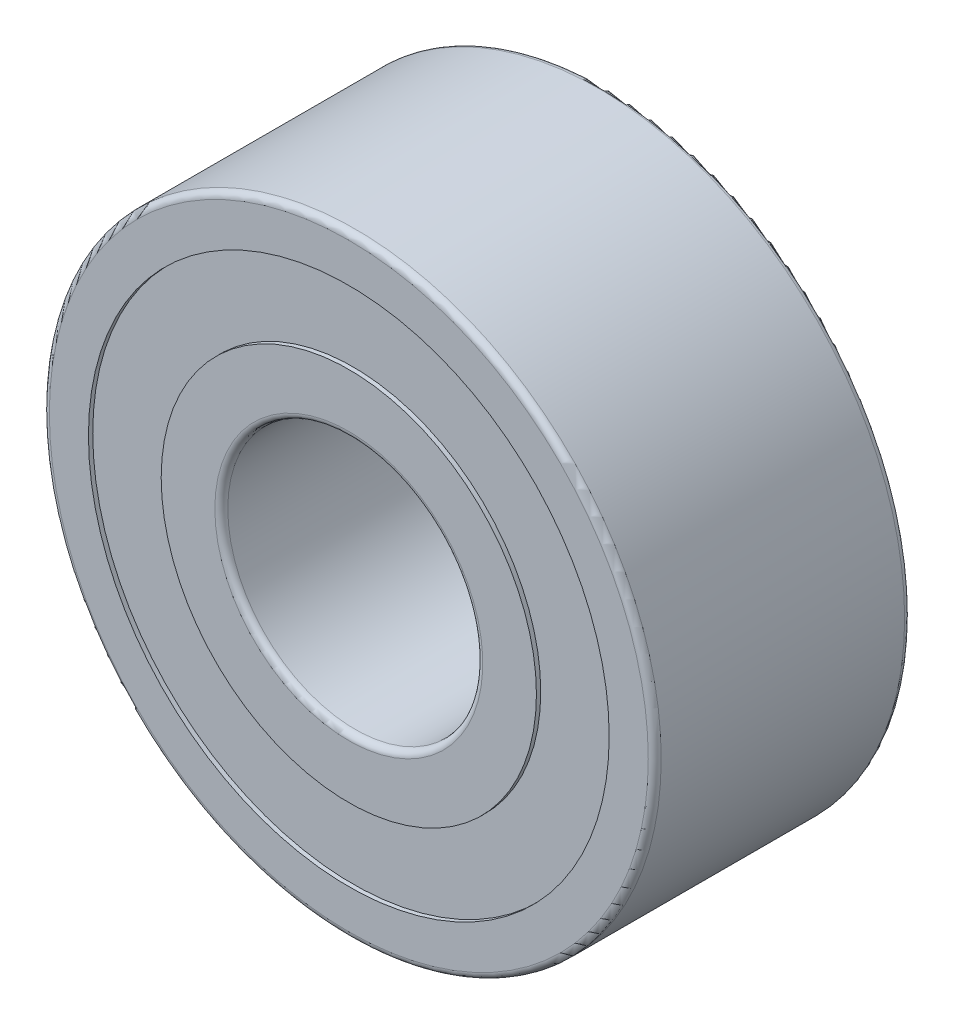
ISO-10303-21;
HEADER;
FILE_DESCRIPTION(('STEP AP214'),'2;1');
FILE_NAME('part.step','',(''),(''),'','','');
FILE_SCHEMA(('AUTOMOTIVE_DESIGN { 1 0 10303 214 1 1 1 1 }'));
ENDSEC;
DATA;
#1=APPLICATION_CONTEXT('core data for automotive mechanical design processes');
#2=APPLICATION_PROTOCOL_DEFINITION('international standard','automotive_design',2000,#1);
#3=PRODUCT_CONTEXT('',#1,'mechanical');
#4=PRODUCT('Part','Part','',(#3));
#5=PRODUCT_RELATED_PRODUCT_CATEGORY('part','',(#4));
#6=PRODUCT_DEFINITION_FORMATION('','',#4);
#7=PRODUCT_DEFINITION_CONTEXT('part definition',#1,'design');
#8=PRODUCT_DEFINITION('design','',#6,#7);
#9=PRODUCT_DEFINITION_SHAPE('','',#8);
#10=(LENGTH_UNIT() NAMED_UNIT(*) SI_UNIT(.MILLI.,.METRE.));
#11=(NAMED_UNIT(*) PLANE_ANGLE_UNIT() SI_UNIT($,.RADIAN.));
#12=(NAMED_UNIT(*) SI_UNIT($,.STERADIAN.) SOLID_ANGLE_UNIT());
#13=UNCERTAINTY_MEASURE_WITH_UNIT(LENGTH_MEASURE(1.E-05),#10,'distance_accuracy_value','');
#14=(GEOMETRIC_REPRESENTATION_CONTEXT(3) GLOBAL_UNCERTAINTY_ASSIGNED_CONTEXT((#13)) GLOBAL_UNIT_ASSIGNED_CONTEXT((#10,
#11,#12)) REPRESENTATION_CONTEXT('',''));
#15=CARTESIAN_POINT('',(0.,0.,0.));
#16=DIRECTION('',(0.,0.,1.));
#17=DIRECTION('',(1.,0.,0.));
#18=AXIS2_PLACEMENT_3D('',#15,#16,#17);
#19=CARTESIAN_POINT('',(0.,0.,0.));
#20=DIRECTION('',(0.,0.,-1.));
#21=DIRECTION('',(-1.00000000000001,0.,0.));
#22=AXIS2_PLACEMENT_3D('',#19,#20,#21);
#23=CYLINDRICAL_SURFACE('',#22,22.0726);
#24=CARTESIAN_POINT('',(0.,0.,13.81125));
#25=DIRECTION('',(0.,0.,-1.));
#26=DIRECTION('',(-1.00000000000001,0.,0.));
#27=AXIS2_PLACEMENT_3D('',#24,#25,#26);
#28=CIRCLE('',#27,22.0726);
#29=CARTESIAN_POINT('',(-22.0726000000001,0.,13.81125));
#30=VERTEX_POINT('',#29);
#31=EDGE_CURVE('E11',#30,#30,#28,.T.);
#32=ORIENTED_EDGE('',*,*,#31,.T.);
#33=EDGE_LOOP('',(#32));
#34=FACE_BOUND('',#33,.T.);
#35=CARTESIAN_POINT('',(0.,0.,14.57325));
#36=DIRECTION('',(0.,0.,-1.));
#37=DIRECTION('',(-1.00000000000001,0.,0.));
#38=AXIS2_PLACEMENT_3D('',#35,#36,#37);
#39=CIRCLE('',#38,22.0726);
#40=CARTESIAN_POINT('',(-22.0726000000001,0.,14.57325));
#41=VERTEX_POINT('',#40);
#42=EDGE_CURVE('E61',#41,#41,#39,.T.);
#43=ORIENTED_EDGE('',*,*,#42,.F.);
#44=EDGE_LOOP('',(#43));
#45=FACE_BOUND('',#44,.T.);
#46=ADVANCED_FACE('F47',(#34,#45),#23,.F.);
#47=CARTESIAN_POINT('',(0.,22.0726000000001,13.81125));
#48=DIRECTION('',(0.,0.,-1.));
#49=DIRECTION('',(-1.00000000000001,0.,0.));
#50=AXIS2_PLACEMENT_3D('',#47,#48,#49);
#51=PLANE('',#50);
#52=CARTESIAN_POINT('',(0.,0.,13.81125));
#53=DIRECTION('',(0.,0.,-1.));
#54=DIRECTION('',(-1.00000000000001,0.,0.));
#55=AXIS2_PLACEMENT_3D('',#52,#53,#54);
#56=CIRCLE('',#55,30.6324);
#57=CARTESIAN_POINT('',(-30.6324000000002,0.,13.81125));
#58=VERTEX_POINT('',#57);
#59=EDGE_CURVE('E53',#58,#58,#56,.T.);
#60=ORIENTED_EDGE('',*,*,#59,.T.);
#61=EDGE_LOOP('',(#60));
#62=FACE_BOUND('',#61,.T.);
#63=ORIENTED_EDGE('',*,*,#31,.F.);
#64=EDGE_LOOP('',(#63));
#65=FACE_BOUND('',#64,.T.);
#66=ADVANCED_FACE('F71',(#62,#65),#51,.T.);
#67=CARTESIAN_POINT('',(0.,0.,0.));
#68=DIRECTION('',(0.,0.,-1.));
#69=DIRECTION('',(-1.00000000000001,0.,0.));
#70=AXIS2_PLACEMENT_3D('',#67,#68,#69);
#71=CYLINDRICAL_SURFACE('',#70,30.6324);
#72=CARTESIAN_POINT('',(0.,0.,14.57325));
#73=DIRECTION('',(0.,0.,-1.));
#74=DIRECTION('',(-1.00000000000001,0.,0.));
#75=AXIS2_PLACEMENT_3D('',#72,#73,#74);
#76=CIRCLE('',#75,30.6324);
#77=CARTESIAN_POINT('',(-30.6324000000002,0.,14.57325));
#78=VERTEX_POINT('',#77);
#79=EDGE_CURVE('E57',#78,#78,#76,.T.);
#80=ORIENTED_EDGE('',*,*,#79,.T.);
#81=EDGE_LOOP('',(#80));
#82=FACE_BOUND('',#81,.T.);
#83=ORIENTED_EDGE('',*,*,#59,.F.);
#84=EDGE_LOOP('',(#83));
#85=FACE_BOUND('',#84,.T.);
#86=ADVANCED_FACE('F75',(#82,#85),#71,.T.);
#87=CARTESIAN_POINT('',(0.,22.0726000000001,14.57325));
#88=DIRECTION('',(0.,0.,1.));
#89=DIRECTION('',(1.00000000000001,0.,0.));
#90=AXIS2_PLACEMENT_3D('',#87,#88,#89);
#91=PLANE('',#90);
#92=ORIENTED_EDGE('',*,*,#42,.T.);
#93=EDGE_LOOP('',(#92));
#94=FACE_BOUND('',#93,.T.);
#95=ORIENTED_EDGE('',*,*,#79,.F.);
#96=EDGE_LOOP('',(#95));
#97=FACE_BOUND('',#96,.T.);
#98=ADVANCED_FACE('F67',(#94,#97),#91,.T.);
#99=CLOSED_SHELL('',(#46,#66,#86,#98));
#100=MANIFOLD_SOLID_BREP('B2',#99);
#101=CARTESIAN_POINT('',(0.,22.0726000000001,-13.81125));
#102=DIRECTION('',(0.,0.,1.));
#103=DIRECTION('',(1.00000000000001,0.,0.));
#104=AXIS2_PLACEMENT_3D('',#101,#102,#103);
#105=PLANE('',#104);
#106=CARTESIAN_POINT('',(0.,0.,-13.81125));
#107=DIRECTION('',(0.,0.,-1.));
#108=DIRECTION('',(-1.00000000000001,0.,0.));
#109=AXIS2_PLACEMENT_3D('',#106,#107,#108);
#110=CIRCLE('',#109,22.0726);
#111=CARTESIAN_POINT('',(-22.0726000000001,0.,-13.81125));
#112=VERTEX_POINT('',#111);
#113=EDGE_CURVE('E46',#112,#112,#110,.T.);
#114=ORIENTED_EDGE('',*,*,#113,.T.);
#115=EDGE_LOOP('',(#114));
#116=FACE_BOUND('',#115,.T.);
#117=CARTESIAN_POINT('',(0.,0.,-13.81125));
#118=DIRECTION('',(0.,0.,-1.));
#119=DIRECTION('',(-1.00000000000001,0.,0.));
#120=AXIS2_PLACEMENT_3D('',#117,#118,#119);
#121=CIRCLE('',#120,30.6324);
#122=CARTESIAN_POINT('',(-30.6324000000002,0.,-13.81125));
#123=VERTEX_POINT('',#122);
#124=EDGE_CURVE('E120',#123,#123,#121,.T.);
#125=ORIENTED_EDGE('',*,*,#124,.F.);
#126=EDGE_LOOP('',(#125));
#127=FACE_BOUND('',#126,.T.);
#128=ADVANCED_FACE('F106',(#116,#127),#105,.T.);
#129=CARTESIAN_POINT('',(0.,0.,0.));
#130=DIRECTION('',(0.,0.,-1.));
#131=DIRECTION('',(-1.00000000000001,0.,0.));
#132=AXIS2_PLACEMENT_3D('',#129,#130,#131);
#133=CYLINDRICAL_SURFACE('',#132,22.0726);
#134=CARTESIAN_POINT('',(0.,0.,-14.57325));
#135=DIRECTION('',(0.,0.,-1.));
#136=DIRECTION('',(-1.00000000000001,0.,0.));
#137=AXIS2_PLACEMENT_3D('',#134,#135,#136);
#138=CIRCLE('',#137,22.0726);
#139=CARTESIAN_POINT('',(-22.0726000000001,0.,-14.57325));
#140=VERTEX_POINT('',#139);
#141=EDGE_CURVE('E112',#140,#140,#138,.T.);
#142=ORIENTED_EDGE('',*,*,#141,.T.);
#143=EDGE_LOOP('',(#142));
#144=FACE_BOUND('',#143,.T.);
#145=ORIENTED_EDGE('',*,*,#113,.F.);
#146=EDGE_LOOP('',(#145));
#147=FACE_BOUND('',#146,.T.);
#148=ADVANCED_FACE('F130',(#144,#147),#133,.F.);
#149=CARTESIAN_POINT('',(0.,22.0726000000001,-14.57325));
#150=DIRECTION('',(0.,0.,-1.));
#151=DIRECTION('',(-1.00000000000001,0.,0.));
#152=AXIS2_PLACEMENT_3D('',#149,#150,#151);
#153=PLANE('',#152);
#154=CARTESIAN_POINT('',(0.,0.,-14.57325));
#155=DIRECTION('',(0.,0.,-1.));
#156=DIRECTION('',(-1.00000000000001,0.,0.));
#157=AXIS2_PLACEMENT_3D('',#154,#155,#156);
#158=CIRCLE('',#157,30.6324);
#159=CARTESIAN_POINT('',(-30.6324000000002,0.,-14.57325));
#160=VERTEX_POINT('',#159);
#161=EDGE_CURVE('E116',#160,#160,#158,.T.);
#162=ORIENTED_EDGE('',*,*,#161,.T.);
#163=EDGE_LOOP('',(#162));
#164=FACE_BOUND('',#163,.T.);
#165=ORIENTED_EDGE('',*,*,#141,.F.);
#166=EDGE_LOOP('',(#165));
#167=FACE_BOUND('',#166,.T.);
#168=ADVANCED_FACE('F134',(#164,#167),#153,.T.);
#169=CARTESIAN_POINT('',(0.,0.,0.));
#170=DIRECTION('',(0.,0.,-1.));
#171=DIRECTION('',(-1.00000000000001,0.,0.));
#172=AXIS2_PLACEMENT_3D('',#169,#170,#171);
#173=CYLINDRICAL_SURFACE('',#172,30.6324);
#174=ORIENTED_EDGE('',*,*,#124,.T.);
#175=EDGE_LOOP('',(#174));
#176=FACE_BOUND('',#175,.T.);
#177=ORIENTED_EDGE('',*,*,#161,.F.);
#178=EDGE_LOOP('',(#177));
#179=FACE_BOUND('',#178,.T.);
#180=ADVANCED_FACE('F126',(#176,#179),#173,.T.);
#181=CLOSED_SHELL('',(#128,#148,#168,#180));
#182=MANIFOLD_SOLID_BREP('B6',#181);
#183=CARTESIAN_POINT('',(18.6340314512184,18.6340314512188,-7.9375));
#184=DIRECTION('',(-0.707106781186543,-0.70710678118656,0.));
#185=DIRECTION('',(0.,0.,-1.));
#186=AXIS2_PLACEMENT_3D('',#183,#184,#185);
#187=SPHERICAL_SURFACE('',#186,5.55625);
#188=CARTESIAN_POINT('',(14.7051693982506,14.705169398251,-7.9375));
#189=VERTEX_POINT('',#188);
#190=VERTEX_LOOP('',#189);
#191=FACE_BOUND('',#190,.T.);
#192=ADVANCED_FACE('F165',(#191),#187,.T.);
#193=CLOSED_SHELL('',(#192));
#194=MANIFOLD_SOLID_BREP('B41',#193);
#195=CARTESIAN_POINT('',(26.3525000000001,2.75821032680312E-13,-7.9375));
#196=DIRECTION('',(-1.,0.,0.));
#197=DIRECTION('',(0.,0.,-1.));
#198=AXIS2_PLACEMENT_3D('',#195,#196,#197);
#199=SPHERICAL_SURFACE('',#198,5.55625);
#200=CARTESIAN_POINT('',(20.7962500000001,2.1814390571695E-13,-7.9375));
#201=VERTEX_POINT('',#200);
#202=VERTEX_LOOP('',#201);
#203=FACE_BOUND('',#202,.T.);
#204=ADVANCED_FACE('F181',(#203),#199,.T.);
#205=CLOSED_SHELL('',(#204));
#206=MANIFOLD_SOLID_BREP('B102',#205);
#207=CARTESIAN_POINT('',(18.6340314512188,-18.6340314512184,-7.9375));
#208=DIRECTION('',(-0.707106781186558,0.707106781186545,0.));
#209=DIRECTION('',(0.,0.,-1.));
#210=AXIS2_PLACEMENT_3D('',#207,#208,#209);
#211=SPHERICAL_SURFACE('',#210,5.55625);
#212=CARTESIAN_POINT('',(14.705169398251,-14.7051693982507,-7.9375));
#213=VERTEX_POINT('',#212);
#214=VERTEX_LOOP('',#213);
#215=FACE_BOUND('',#214,.T.);
#216=ADVANCED_FACE('F197',(#215),#211,.T.);
#217=CLOSED_SHELL('',(#216));
#218=MANIFOLD_SOLID_BREP('B161',#217);
#219=CARTESIAN_POINT('',(0.,-26.3525000000001,-7.9375));
#220=DIRECTION('',(0.,1.00000000000001,0.));
#221=DIRECTION('',(0.,0.,-1.));
#222=AXIS2_PLACEMENT_3D('',#219,#220,#221);
#223=SPHERICAL_SURFACE('',#222,5.55625);
#224=CARTESIAN_POINT('',(0.,-20.7962500000001,-7.9375));
#225=VERTEX_POINT('',#224);
#226=VERTEX_LOOP('',#225);
#227=FACE_BOUND('',#226,.T.);
#228=ADVANCED_FACE('F213',(#227),#223,.T.);
#229=CLOSED_SHELL('',(#228));
#230=MANIFOLD_SOLID_BREP('B177',#229);
#231=CARTESIAN_POINT('',(-18.6340314512185,-18.6340314512187,-7.9375));
#232=DIRECTION('',(0.707106781186547,0.707106781186555,0.));
#233=DIRECTION('',(0.,0.,-1.));
#234=AXIS2_PLACEMENT_3D('',#231,#232,#233);
#235=SPHERICAL_SURFACE('',#234,5.55625);
#236=CARTESIAN_POINT('',(-14.7051693982507,-14.7051693982509,-7.9375));
#237=VERTEX_POINT('',#236);
#238=VERTEX_LOOP('',#237);
#239=FACE_BOUND('',#238,.T.);
#240=ADVANCED_FACE('F229',(#239),#235,.T.);
#241=CLOSED_SHELL('',(#240));
#242=MANIFOLD_SOLID_BREP('B193',#241);
#243=CARTESIAN_POINT('',(-26.3525000000001,0.,-7.9375));
#244=DIRECTION('',(1.,0.,0.));
#245=DIRECTION('',(0.,0.,-1.));
#246=AXIS2_PLACEMENT_3D('',#243,#244,#245);
#247=SPHERICAL_SURFACE('',#246,5.55625);
#248=CARTESIAN_POINT('',(-20.7962500000001,0.,-7.9375));
#249=VERTEX_POINT('',#248);
#250=VERTEX_LOOP('',#249);
#251=FACE_BOUND('',#250,.T.);
#252=ADVANCED_FACE('F245',(#251),#247,.T.);
#253=CLOSED_SHELL('',(#252));
#254=MANIFOLD_SOLID_BREP('B209',#253);
#255=CARTESIAN_POINT('',(-18.6340314512186,18.6340314512185,-7.9375));
#256=DIRECTION('',(0.707106781186553,-0.70710678118655,0.));
#257=DIRECTION('',(0.,0.,-1.));
#258=AXIS2_PLACEMENT_3D('',#255,#256,#257);
#259=SPHERICAL_SURFACE('',#258,5.55625);
#260=CARTESIAN_POINT('',(-14.7051693982509,14.7051693982508,-7.9375));
#261=VERTEX_POINT('',#260);
#262=VERTEX_LOOP('',#261);
#263=FACE_BOUND('',#262,.T.);
#264=ADVANCED_FACE('F261',(#263),#259,.T.);
#265=CLOSED_SHELL('',(#264));
#266=MANIFOLD_SOLID_BREP('B225',#265);
#267=CARTESIAN_POINT('',(18.6340314512184,18.6340314512188,7.9375));
#268=DIRECTION('',(0.707106781186543,0.70710678118656,0.));
#269=DIRECTION('',(0.,0.,-1.));
#270=AXIS2_PLACEMENT_3D('',#267,#268,#269);
#271=SPHERICAL_SURFACE('',#270,5.55625);
#272=CARTESIAN_POINT('',(22.5628935041861,22.5628935041867,7.9375));
#273=VERTEX_POINT('',#272);
#274=VERTEX_LOOP('',#273);
#275=FACE_BOUND('',#274,.T.);
#276=ADVANCED_FACE('F277',(#275),#271,.T.);
#277=CLOSED_SHELL('',(#276));
#278=MANIFOLD_SOLID_BREP('B241',#277);
#279=CARTESIAN_POINT('',(26.3525000000001,2.75821032680312E-13,7.9375));
#280=DIRECTION('',(1.,0.,0.));
#281=DIRECTION('',(0.,0.,-1.));
#282=AXIS2_PLACEMENT_3D('',#279,#280,#281);
#283=SPHERICAL_SURFACE('',#282,5.55625);
#284=CARTESIAN_POINT('',(31.9087500000001,3.33498159643675E-13,7.9375));
#285=VERTEX_POINT('',#284);
#286=VERTEX_LOOP('',#285);
#287=FACE_BOUND('',#286,.T.);
#288=ADVANCED_FACE('F293',(#287),#283,.T.);
#289=CLOSED_SHELL('',(#288));
#290=MANIFOLD_SOLID_BREP('B257',#289);
#291=CARTESIAN_POINT('',(18.6340314512188,-18.6340314512184,7.9375));
#292=DIRECTION('',(0.707106781186558,-0.707106781186545,0.));
#293=DIRECTION('',(0.,0.,-1.));
#294=AXIS2_PLACEMENT_3D('',#291,#292,#293);
#295=SPHERICAL_SURFACE('',#294,5.55625);
#296=CARTESIAN_POINT('',(22.5628935041866,-22.5628935041862,7.9375));
#297=VERTEX_POINT('',#296);
#298=VERTEX_LOOP('',#297);
#299=FACE_BOUND('',#298,.T.);
#300=ADVANCED_FACE('F309',(#299),#295,.T.);
#301=CLOSED_SHELL('',(#300));
#302=MANIFOLD_SOLID_BREP('B273',#301);
#303=CARTESIAN_POINT('',(0.,-26.3525000000001,7.9375));
#304=DIRECTION('',(0.,-1.00000000000001,0.));
#305=DIRECTION('',(0.,0.,-1.));
#306=AXIS2_PLACEMENT_3D('',#303,#304,#305);
#307=SPHERICAL_SURFACE('',#306,5.55625);
#308=CARTESIAN_POINT('',(0.,-31.9087500000002,7.9375));
#309=VERTEX_POINT('',#308);
#310=VERTEX_LOOP('',#309);
#311=FACE_BOUND('',#310,.T.);
#312=ADVANCED_FACE('F325',(#311),#307,.T.);
#313=CLOSED_SHELL('',(#312));
#314=MANIFOLD_SOLID_BREP('B289',#313);
#315=CARTESIAN_POINT('',(-18.6340314512185,-18.6340314512187,7.9375));
#316=DIRECTION('',(-0.707106781186547,-0.707106781186555,0.));
#317=DIRECTION('',(0.,0.,-1.));
#318=AXIS2_PLACEMENT_3D('',#315,#316,#317);
#319=SPHERICAL_SURFACE('',#318,5.55625);
#320=CARTESIAN_POINT('',(-22.5628935041862,-22.5628935041865,7.9375));
#321=VERTEX_POINT('',#320);
#322=VERTEX_LOOP('',#321);
#323=FACE_BOUND('',#322,.T.);
#324=ADVANCED_FACE('F341',(#323),#319,.T.);
#325=CLOSED_SHELL('',(#324));
#326=MANIFOLD_SOLID_BREP('B305',#325);
#327=CARTESIAN_POINT('',(-26.3525000000001,0.,7.9375));
#328=DIRECTION('',(-1.,0.,0.));
#329=DIRECTION('',(0.,0.,-1.));
#330=AXIS2_PLACEMENT_3D('',#327,#328,#329);
#331=SPHERICAL_SURFACE('',#330,5.55625);
#332=CARTESIAN_POINT('',(-31.9087500000002,-1.14841122722531E-13,7.9375));
#333=VERTEX_POINT('',#332);
#334=VERTEX_LOOP('',#333);
#335=FACE_BOUND('',#334,.T.);
#336=ADVANCED_FACE('F357',(#335),#331,.T.);
#337=CLOSED_SHELL('',(#336));
#338=MANIFOLD_SOLID_BREP('B321',#337);
#339=CARTESIAN_POINT('',(-18.6340314512186,18.6340314512185,7.9375));
#340=DIRECTION('',(-0.707106781186553,0.70710678118655,0.));
#341=DIRECTION('',(0.,0.,-1.));
#342=AXIS2_PLACEMENT_3D('',#339,#340,#341);
#343=SPHERICAL_SURFACE('',#342,5.55625);
#344=CARTESIAN_POINT('',(-22.5628935041864,22.5628935041863,7.9375));
#345=VERTEX_POINT('',#344);
#346=VERTEX_LOOP('',#345);
#347=FACE_BOUND('',#346,.T.);
#348=ADVANCED_FACE('F373',(#347),#343,.T.);
#349=CLOSED_SHELL('',(#348));
#350=MANIFOLD_SOLID_BREP('B337',#349);
#351=CARTESIAN_POINT('',(0.,26.3525000000001,7.9375));
#352=DIRECTION('',(0.,1.00000000000001,0.));
#353=DIRECTION('',(0.,0.,-1.));
#354=AXIS2_PLACEMENT_3D('',#351,#352,#353);
#355=SPHERICAL_SURFACE('',#354,5.55625);
#356=CARTESIAN_POINT('',(0.,31.9087500000002,7.9375));
#357=VERTEX_POINT('',#356);
#358=VERTEX_LOOP('',#357);
#359=FACE_BOUND('',#358,.T.);
#360=ADVANCED_FACE('F389',(#359),#355,.T.);
#361=CLOSED_SHELL('',(#360));
#362=MANIFOLD_SOLID_BREP('B353',#361);
#363=CARTESIAN_POINT('',(0.,26.3525000000001,-7.9375));
#364=DIRECTION('',(0.,-1.00000000000001,0.));
#365=DIRECTION('',(0.,0.,-1.));
#366=AXIS2_PLACEMENT_3D('',#363,#364,#365);
#367=SPHERICAL_SURFACE('',#366,5.55625);
#368=CARTESIAN_POINT('',(0.,20.7962500000001,-7.9375));
#369=VERTEX_POINT('',#368);
#370=VERTEX_LOOP('',#369);
#371=FACE_BOUND('',#370,.T.);
#372=ADVANCED_FACE('F407',(#371),#367,.T.);
#373=CLOSED_SHELL('',(#372));
#374=MANIFOLD_SOLID_BREP('B369',#373);
#375=CARTESIAN_POINT('',(0.,0.,0.));
#376=DIRECTION('',(0.,0.,1.));
#377=DIRECTION('',(1.00000000000001,0.,0.));
#378=AXIS2_PLACEMENT_3D('',#375,#376,#377);
#379=CYLINDRICAL_SURFACE('',#378,30.6324);
#380=CARTESIAN_POINT('',(0.,0.,-15.08125));
#381=DIRECTION('',(0.,0.,1.));
#382=DIRECTION('',(1.00000000000001,0.,0.));
#383=AXIS2_PLACEMENT_3D('',#380,#381,#382);
#384=CIRCLE('',#383,30.6324);
#385=CARTESIAN_POINT('',(30.6324000000002,0.,-15.08125));
#386=VERTEX_POINT('',#385);
#387=EDGE_CURVE('E459',#386,#386,#384,.T.);
#388=ORIENTED_EDGE('',*,*,#387,.F.);
#389=EDGE_LOOP('',(#388));
#390=FACE_BOUND('',#389,.T.);
#391=CARTESIAN_POINT('',(0.,0.,-11.4807146495097));
#392=DIRECTION('',(0.,0.,1.));
#393=DIRECTION('',(1.00000000000001,0.,0.));
#394=AXIS2_PLACEMENT_3D('',#391,#392,#393);
#395=CIRCLE('',#394,30.6324);
#396=CARTESIAN_POINT('',(30.6324000000002,0.,-11.4807146495097));
#397=VERTEX_POINT('',#396);
#398=EDGE_CURVE('E444',#397,#397,#395,.T.);
#399=ORIENTED_EDGE('',*,*,#398,.T.);
#400=EDGE_LOOP('',(#399));
#401=FACE_BOUND('',#400,.T.);
#402=ADVANCED_FACE('F424',(#390,#401),#379,.F.);
#403=CARTESIAN_POINT('',(0.,0.,-7.9375));
#404=DIRECTION('',(0.,0.,1.));
#405=DIRECTION('',(1.00000000000001,0.,0.));
#406=AXIS2_PLACEMENT_3D('',#403,#404,#405);
#407=TOROIDAL_SURFACE('',#406,26.3525,5.55625);
#408=ORIENTED_EDGE('',*,*,#398,.F.);
#409=EDGE_LOOP('',(#408));
#410=FACE_BOUND('',#409,.T.);
#411=CARTESIAN_POINT('',(0.,0.,-4.39428535049031));
#412=DIRECTION('',(0.,0.,1.));
#413=DIRECTION('',(1.00000000000001,0.,0.));
#414=AXIS2_PLACEMENT_3D('',#411,#412,#413);
#415=CIRCLE('',#414,30.6324);
#416=CARTESIAN_POINT('',(30.6324000000002,0.,-4.39428535049031));
#417=VERTEX_POINT('',#416);
#418=EDGE_CURVE('E447',#417,#417,#415,.T.);
#419=ORIENTED_EDGE('',*,*,#418,.T.);
#420=EDGE_LOOP('',(#419));
#421=FACE_BOUND('',#420,.T.);
#422=ADVANCED_FACE('F467',(#410,#421),#407,.F.);
#423=CARTESIAN_POINT('',(0.,0.,0.));
#424=DIRECTION('',(0.,0.,1.));
#425=DIRECTION('',(1.00000000000001,0.,0.));
#426=AXIS2_PLACEMENT_3D('',#423,#424,#425);
#427=CYLINDRICAL_SURFACE('',#426,30.6324);
#428=ORIENTED_EDGE('',*,*,#418,.F.);
#429=EDGE_LOOP('',(#428));
#430=FACE_BOUND('',#429,.T.);
#431=CARTESIAN_POINT('',(0.,0.,4.39428535049031));
#432=DIRECTION('',(0.,0.,1.));
#433=DIRECTION('',(1.00000000000001,0.,0.));
#434=AXIS2_PLACEMENT_3D('',#431,#432,#433);
#435=CIRCLE('',#434,30.6324);
#436=CARTESIAN_POINT('',(30.6324000000002,0.,4.39428535049031));
#437=VERTEX_POINT('',#436);
#438=EDGE_CURVE('E450',#437,#437,#435,.T.);
#439=ORIENTED_EDGE('',*,*,#438,.T.);
#440=EDGE_LOOP('',(#439));
#441=FACE_BOUND('',#440,.T.);
#442=ADVANCED_FACE('F473',(#430,#441),#427,.F.);
#443=CARTESIAN_POINT('',(0.,0.,7.9375));
#444=DIRECTION('',(0.,0.,1.));
#445=DIRECTION('',(1.00000000000001,0.,0.));
#446=AXIS2_PLACEMENT_3D('',#443,#444,#445);
#447=TOROIDAL_SURFACE('',#446,26.3525,5.55625);
#448=ORIENTED_EDGE('',*,*,#438,.F.);
#449=EDGE_LOOP('',(#448));
#450=FACE_BOUND('',#449,.T.);
#451=CARTESIAN_POINT('',(0.,0.,11.4807146495097));
#452=DIRECTION('',(0.,0.,1.));
#453=DIRECTION('',(1.00000000000001,0.,0.));
#454=AXIS2_PLACEMENT_3D('',#451,#452,#453);
#455=CIRCLE('',#454,30.6324);
#456=CARTESIAN_POINT('',(30.6324000000002,0.,11.4807146495097));
#457=VERTEX_POINT('',#456);
#458=EDGE_CURVE('E453',#457,#457,#455,.T.);
#459=ORIENTED_EDGE('',*,*,#458,.T.);
#460=EDGE_LOOP('',(#459));
#461=FACE_BOUND('',#460,.T.);
#462=ADVANCED_FACE('F479',(#450,#461),#447,.F.);
#463=CARTESIAN_POINT('',(0.,0.,0.));
#464=DIRECTION('',(0.,0.,1.));
#465=DIRECTION('',(1.00000000000001,0.,0.));
#466=AXIS2_PLACEMENT_3D('',#463,#464,#465);
#467=CYLINDRICAL_SURFACE('',#466,30.6324);
#468=ORIENTED_EDGE('',*,*,#458,.F.);
#469=EDGE_LOOP('',(#468));
#470=FACE_BOUND('',#469,.T.);
#471=CARTESIAN_POINT('',(0.,0.,15.08125));
#472=DIRECTION('',(0.,0.,1.));
#473=DIRECTION('',(1.00000000000001,0.,0.));
#474=AXIS2_PLACEMENT_3D('',#471,#472,#473);
#475=CIRCLE('',#474,30.6324);
#476=CARTESIAN_POINT('',(30.6324000000002,0.,15.08125));
#477=VERTEX_POINT('',#476);
#478=EDGE_CURVE('E456',#477,#477,#475,.T.);
#479=ORIENTED_EDGE('',*,*,#478,.T.);
#480=EDGE_LOOP('',(#479));
#481=FACE_BOUND('',#480,.T.);
#482=ADVANCED_FACE('F485',(#470,#481),#467,.F.);
#483=CARTESIAN_POINT('',(0.,30.6324000000001,15.08125));
#484=DIRECTION('',(0.,0.,-1.));
#485=DIRECTION('',(-1.00000000000001,0.,0.));
#486=AXIS2_PLACEMENT_3D('',#483,#484,#485);
#487=PLANE('',#486);
#488=CARTESIAN_POINT('',(0.,0.,15.08125));
#489=DIRECTION('',(0.,0.,-1.));
#490=DIRECTION('',(-1.00000000000001,0.,0.));
#491=AXIS2_PLACEMENT_3D('',#488,#489,#490);
#492=CIRCLE('',#491,35.2298);
#493=CARTESIAN_POINT('',(-35.2298000000002,0.,15.08125));
#494=VERTEX_POINT('',#493);
#495=EDGE_CURVE('E439',#494,#494,#492,.F.);
#496=ORIENTED_EDGE('',*,*,#495,.T.);
#497=EDGE_LOOP('',(#496));
#498=FACE_BOUND('',#497,.T.);
#499=ORIENTED_EDGE('',*,*,#478,.F.);
#500=EDGE_LOOP('',(#499));
#501=FACE_BOUND('',#500,.T.);
#502=ADVANCED_FACE('F491',(#498,#501),#487,.F.);
#503=CARTESIAN_POINT('',(0.,0.,0.));
#504=DIRECTION('',(0.,0.,1.));
#505=DIRECTION('',(1.00000000000001,0.,0.));
#506=AXIS2_PLACEMENT_3D('',#503,#504,#505);
#507=CYLINDRICAL_SURFACE('',#506,35.9918);
#508=CARTESIAN_POINT('',(0.,0.,14.31925));
#509=DIRECTION('',(0.,0.,-1.));
#510=DIRECTION('',(-1.00000000000001,0.,0.));
#511=AXIS2_PLACEMENT_3D('',#508,#509,#510);
#512=CIRCLE('',#511,35.9918);
#513=CARTESIAN_POINT('',(-35.9918000000002,0.,14.31925));
#514=VERTEX_POINT('',#513);
#515=EDGE_CURVE('E431',#514,#514,#512,.T.);
#516=ORIENTED_EDGE('',*,*,#515,.T.);
#517=EDGE_LOOP('',(#516));
#518=FACE_BOUND('',#517,.T.);
#519=CARTESIAN_POINT('',(0.,0.,-14.31925));
#520=DIRECTION('',(0.,0.,1.));
#521=DIRECTION('',(1.00000000000001,0.,0.));
#522=AXIS2_PLACEMENT_3D('',#519,#520,#521);
#523=CIRCLE('',#522,35.9918);
#524=CARTESIAN_POINT('',(35.9918000000002,0.,-14.31925));
#525=VERTEX_POINT('',#524);
#526=EDGE_CURVE('E435',#525,#525,#523,.T.);
#527=ORIENTED_EDGE('',*,*,#526,.T.);
#528=EDGE_LOOP('',(#527));
#529=FACE_BOUND('',#528,.T.);
#530=ADVANCED_FACE('F496',(#518,#529),#507,.T.);
#531=CARTESIAN_POINT('',(0.,30.6324000000001,-15.08125));
#532=DIRECTION('',(0.,0.,1.));
#533=DIRECTION('',(1.00000000000001,0.,0.));
#534=AXIS2_PLACEMENT_3D('',#531,#532,#533);
#535=PLANE('',#534);
#536=CARTESIAN_POINT('',(0.,0.,-15.08125));
#537=DIRECTION('',(0.,0.,1.));
#538=DIRECTION('',(1.00000000000001,0.,0.));
#539=AXIS2_PLACEMENT_3D('',#536,#537,#538);
#540=CIRCLE('',#539,35.2298);
#541=CARTESIAN_POINT('',(35.2298000000002,0.,-15.08125));
#542=VERTEX_POINT('',#541);
#543=EDGE_CURVE('E406',#542,#542,#540,.F.);
#544=ORIENTED_EDGE('',*,*,#543,.T.);
#545=EDGE_LOOP('',(#544));
#546=FACE_BOUND('',#545,.T.);
#547=ORIENTED_EDGE('',*,*,#387,.T.);
#548=EDGE_LOOP('',(#547));
#549=FACE_BOUND('',#548,.T.);
#550=ADVANCED_FACE('F463',(#546,#549),#535,.F.);
#551=CARTESIAN_POINT('',(0.,0.,14.31925));
#552=DIRECTION('',(0.,0.,-1.));
#553=DIRECTION('',(-1.00000000000001,0.,0.));
#554=AXIS2_PLACEMENT_3D('',#551,#552,#553);
#555=TOROIDAL_SURFACE('',#554,35.2298,0.762);
#556=ORIENTED_EDGE('',*,*,#515,.F.);
#557=EDGE_LOOP('',(#556));
#558=FACE_BOUND('',#557,.T.);
#559=ORIENTED_EDGE('',*,*,#495,.F.);
#560=EDGE_LOOP('',(#559));
#561=FACE_BOUND('',#560,.T.);
#562=ADVANCED_FACE('F504',(#558,#561),#555,.T.);
#563=CARTESIAN_POINT('',(0.,0.,-14.31925));
#564=DIRECTION('',(0.,0.,1.));
#565=DIRECTION('',(1.00000000000001,0.,0.));
#566=AXIS2_PLACEMENT_3D('',#563,#564,#565);
#567=TOROIDAL_SURFACE('',#566,35.2298,0.762);
#568=ORIENTED_EDGE('',*,*,#543,.F.);
#569=EDGE_LOOP('',(#568));
#570=FACE_BOUND('',#569,.T.);
#571=ORIENTED_EDGE('',*,*,#526,.F.);
#572=EDGE_LOOP('',(#571));
#573=FACE_BOUND('',#572,.T.);
#574=ADVANCED_FACE('F426',(#570,#573),#567,.T.);
#575=CLOSED_SHELL('',(#402,#422,#442,#462,#482,#502,#530,#550,#562,#574));
#576=MANIFOLD_SOLID_BREP('B385',#575);
#577=CARTESIAN_POINT('',(0.,0.,0.));
#578=DIRECTION('',(0.,0.,1.));
#579=DIRECTION('',(1.00000000000001,0.,0.));
#580=AXIS2_PLACEMENT_3D('',#577,#578,#579);
#581=CYLINDRICAL_SURFACE('',#580,15.);
#582=CARTESIAN_POINT('',(0.,0.,-14.31925));
#583=DIRECTION('',(0.,0.,1.));
#584=DIRECTION('',(1.00000000000001,0.,0.));
#585=AXIS2_PLACEMENT_3D('',#582,#583,#584);
#586=CIRCLE('',#585,15.);
#587=CARTESIAN_POINT('',(15.0000000000001,0.,-14.31925));
#588=VERTEX_POINT('',#587);
#589=EDGE_CURVE('E562',#588,#588,#586,.F.);
#590=ORIENTED_EDGE('',*,*,#589,.T.);
#591=EDGE_LOOP('',(#590));
#592=FACE_BOUND('',#591,.T.);
#593=CARTESIAN_POINT('',(0.,0.,14.31925));
#594=DIRECTION('',(0.,0.,-1.));
#595=DIRECTION('',(-1.00000000000001,0.,0.));
#596=AXIS2_PLACEMENT_3D('',#593,#594,#595);
#597=CIRCLE('',#596,15.);
#598=CARTESIAN_POINT('',(-15.0000000000001,0.,14.31925));
#599=VERTEX_POINT('',#598);
#600=EDGE_CURVE('E566',#599,#599,#597,.F.);
#601=ORIENTED_EDGE('',*,*,#600,.T.);
#602=EDGE_LOOP('',(#601));
#603=FACE_BOUND('',#602,.T.);
#604=ADVANCED_FACE('F555',(#592,#603),#581,.F.);
#605=CARTESIAN_POINT('',(0.,15.0000000000001,-15.08125));
#606=DIRECTION('',(0.,0.,1.));
#607=DIRECTION('',(1.00000000000001,0.,0.));
#608=AXIS2_PLACEMENT_3D('',#605,#606,#607);
#609=PLANE('',#608);
#610=CARTESIAN_POINT('',(0.,0.,-15.08125));
#611=DIRECTION('',(0.,0.,1.));
#612=DIRECTION('',(1.00000000000001,0.,0.));
#613=AXIS2_PLACEMENT_3D('',#610,#611,#612);
#614=CIRCLE('',#613,15.762);
#615=CARTESIAN_POINT('',(15.7620000000001,0.,-15.08125));
#616=VERTEX_POINT('',#615);
#617=EDGE_CURVE('E570',#616,#616,#614,.T.);
#618=ORIENTED_EDGE('',*,*,#617,.T.);
#619=EDGE_LOOP('',(#618));
#620=FACE_BOUND('',#619,.T.);
#621=CARTESIAN_POINT('',(0.,0.,-15.08125));
#622=DIRECTION('',(0.,0.,1.));
#623=DIRECTION('',(1.00000000000001,0.,0.));
#624=AXIS2_PLACEMENT_3D('',#621,#622,#623);
#625=CIRCLE('',#624,22.0726);
#626=CARTESIAN_POINT('',(22.0726000000001,0.,-15.08125));
#627=VERTEX_POINT('',#626);
#628=EDGE_CURVE('E575',#627,#627,#625,.T.);
#629=ORIENTED_EDGE('',*,*,#628,.F.);
#630=EDGE_LOOP('',(#629));
#631=FACE_BOUND('',#630,.T.);
#632=ADVANCED_FACE('F623',(#620,#631),#609,.F.);
#633=CARTESIAN_POINT('',(0.,0.,0.));
#634=DIRECTION('',(0.,0.,1.));
#635=DIRECTION('',(1.00000000000001,0.,0.));
#636=AXIS2_PLACEMENT_3D('',#633,#634,#635);
#637=CYLINDRICAL_SURFACE('',#636,22.0726);
#638=CARTESIAN_POINT('',(0.,0.,-11.4807146495097));
#639=DIRECTION('',(0.,0.,1.));
#640=DIRECTION('',(1.00000000000001,0.,0.));
#641=AXIS2_PLACEMENT_3D('',#638,#639,#640);
#642=CIRCLE('',#641,22.0726);
#643=CARTESIAN_POINT('',(22.0726000000001,0.,-11.4807146495097));
#644=VERTEX_POINT('',#643);
#645=EDGE_CURVE('E578',#644,#644,#642,.T.);
#646=ORIENTED_EDGE('',*,*,#645,.F.);
#647=EDGE_LOOP('',(#646));
#648=FACE_BOUND('',#647,.T.);
#649=ORIENTED_EDGE('',*,*,#628,.T.);
#650=EDGE_LOOP('',(#649));
#651=FACE_BOUND('',#650,.T.);
#652=ADVANCED_FACE('F617',(#648,#651),#637,.T.);
#653=CARTESIAN_POINT('',(0.,0.,-7.9375));
#654=DIRECTION('',(0.,0.,1.));
#655=DIRECTION('',(1.00000000000001,0.,0.));
#656=AXIS2_PLACEMENT_3D('',#653,#654,#655);
#657=TOROIDAL_SURFACE('',#656,26.3525,5.55625);
#658=CARTESIAN_POINT('',(0.,0.,-4.39428535049031));
#659=DIRECTION('',(0.,0.,1.));
#660=DIRECTION('',(1.00000000000001,0.,0.));
#661=AXIS2_PLACEMENT_3D('',#658,#659,#660);
#662=CIRCLE('',#661,22.0726);
#663=CARTESIAN_POINT('',(22.0726000000001,0.,-4.39428535049031));
#664=VERTEX_POINT('',#663);
#665=EDGE_CURVE('E581',#664,#664,#662,.T.);
#666=ORIENTED_EDGE('',*,*,#665,.F.);
#667=EDGE_LOOP('',(#666));
#668=FACE_BOUND('',#667,.T.);
#669=ORIENTED_EDGE('',*,*,#645,.T.);
#670=EDGE_LOOP('',(#669));
#671=FACE_BOUND('',#670,.T.);
#672=ADVANCED_FACE('F611',(#668,#671),#657,.F.);
#673=CARTESIAN_POINT('',(0.,0.,0.));
#674=DIRECTION('',(0.,0.,1.));
#675=DIRECTION('',(1.00000000000001,0.,0.));
#676=AXIS2_PLACEMENT_3D('',#673,#674,#675);
#677=CYLINDRICAL_SURFACE('',#676,22.0726);
#678=CARTESIAN_POINT('',(0.,0.,4.39428535049031));
#679=DIRECTION('',(0.,0.,1.));
#680=DIRECTION('',(1.00000000000001,0.,0.));
#681=AXIS2_PLACEMENT_3D('',#678,#679,#680);
#682=CIRCLE('',#681,22.0726);
#683=CARTESIAN_POINT('',(22.0726000000001,0.,4.39428535049031));
#684=VERTEX_POINT('',#683);
#685=EDGE_CURVE('E584',#684,#684,#682,.T.);
#686=ORIENTED_EDGE('',*,*,#685,.F.);
#687=EDGE_LOOP('',(#686));
#688=FACE_BOUND('',#687,.T.);
#689=ORIENTED_EDGE('',*,*,#665,.T.);
#690=EDGE_LOOP('',(#689));
#691=FACE_BOUND('',#690,.T.);
#692=ADVANCED_FACE('F605',(#688,#691),#677,.T.);
#693=CARTESIAN_POINT('',(0.,0.,7.9375));
#694=DIRECTION('',(0.,0.,1.));
#695=DIRECTION('',(1.00000000000001,0.,0.));
#696=AXIS2_PLACEMENT_3D('',#693,#694,#695);
#697=TOROIDAL_SURFACE('',#696,26.3525,5.55625);
#698=CARTESIAN_POINT('',(0.,0.,11.4807146495097));
#699=DIRECTION('',(0.,0.,1.));
#700=DIRECTION('',(1.00000000000001,0.,0.));
#701=AXIS2_PLACEMENT_3D('',#698,#699,#700);
#702=CIRCLE('',#701,22.0726);
#703=CARTESIAN_POINT('',(22.0726000000001,0.,11.4807146495097));
#704=VERTEX_POINT('',#703);
#705=EDGE_CURVE('E587',#704,#704,#702,.T.);
#706=ORIENTED_EDGE('',*,*,#705,.F.);
#707=EDGE_LOOP('',(#706));
#708=FACE_BOUND('',#707,.T.);
#709=ORIENTED_EDGE('',*,*,#685,.T.);
#710=EDGE_LOOP('',(#709));
#711=FACE_BOUND('',#710,.T.);
#712=ADVANCED_FACE('F599',(#708,#711),#697,.F.);
#713=CARTESIAN_POINT('',(0.,0.,0.));
#714=DIRECTION('',(0.,0.,1.));
#715=DIRECTION('',(1.00000000000001,0.,0.));
#716=AXIS2_PLACEMENT_3D('',#713,#714,#715);
#717=CYLINDRICAL_SURFACE('',#716,22.0726);
#718=CARTESIAN_POINT('',(0.,0.,15.08125));
#719=DIRECTION('',(0.,0.,1.));
#720=DIRECTION('',(1.00000000000001,0.,0.));
#721=AXIS2_PLACEMENT_3D('',#718,#719,#720);
#722=CIRCLE('',#721,22.0726);
#723=CARTESIAN_POINT('',(22.0726000000001,0.,15.08125));
#724=VERTEX_POINT('',#723);
#725=EDGE_CURVE('E590',#724,#724,#722,.T.);
#726=ORIENTED_EDGE('',*,*,#725,.F.);
#727=EDGE_LOOP('',(#726));
#728=FACE_BOUND('',#727,.T.);
#729=ORIENTED_EDGE('',*,*,#705,.T.);
#730=EDGE_LOOP('',(#729));
#731=FACE_BOUND('',#730,.T.);
#732=ADVANCED_FACE('F596',(#728,#731),#717,.T.);
#733=CARTESIAN_POINT('',(0.,15.0000000000001,15.08125));
#734=DIRECTION('',(0.,0.,-1.));
#735=DIRECTION('',(-1.00000000000001,0.,0.));
#736=AXIS2_PLACEMENT_3D('',#733,#734,#735);
#737=PLANE('',#736);
#738=CARTESIAN_POINT('',(0.,0.,15.08125));
#739=DIRECTION('',(0.,0.,-1.));
#740=DIRECTION('',(-1.00000000000001,0.,0.));
#741=AXIS2_PLACEMENT_3D('',#738,#739,#740);
#742=CIRCLE('',#741,15.762);
#743=CARTESIAN_POINT('',(-15.7620000000001,0.,15.08125));
#744=VERTEX_POINT('',#743);
#745=EDGE_CURVE('E423',#744,#744,#742,.T.);
#746=ORIENTED_EDGE('',*,*,#745,.T.);
#747=EDGE_LOOP('',(#746));
#748=FACE_BOUND('',#747,.T.);
#749=ORIENTED_EDGE('',*,*,#725,.T.);
#750=EDGE_LOOP('',(#749));
#751=FACE_BOUND('',#750,.T.);
#752=ADVANCED_FACE('F594',(#748,#751),#737,.F.);
#753=CARTESIAN_POINT('',(0.,0.,-14.31925));
#754=DIRECTION('',(0.,0.,1.));
#755=DIRECTION('',(1.00000000000001,0.,0.));
#756=AXIS2_PLACEMENT_3D('',#753,#754,#755);
#757=TOROIDAL_SURFACE('',#756,15.762,0.762);
#758=ORIENTED_EDGE('',*,*,#589,.F.);
#759=EDGE_LOOP('',(#758));
#760=FACE_BOUND('',#759,.T.);
#761=ORIENTED_EDGE('',*,*,#617,.F.);
#762=EDGE_LOOP('',(#761));
#763=FACE_BOUND('',#762,.T.);
#764=ADVANCED_FACE('F634',(#760,#763),#757,.T.);
#765=CARTESIAN_POINT('',(0.,0.,14.31925));
#766=DIRECTION('',(0.,0.,-1.));
#767=DIRECTION('',(-1.00000000000001,0.,0.));
#768=AXIS2_PLACEMENT_3D('',#765,#766,#767);
#769=TOROIDAL_SURFACE('',#768,15.762,0.762);
#770=ORIENTED_EDGE('',*,*,#745,.F.);
#771=EDGE_LOOP('',(#770));
#772=FACE_BOUND('',#771,.T.);
#773=ORIENTED_EDGE('',*,*,#600,.F.);
#774=EDGE_LOOP('',(#773));
#775=FACE_BOUND('',#774,.T.);
#776=ADVANCED_FACE('F557',(#772,#775),#769,.T.);
#777=CLOSED_SHELL('',(#604,#632,#652,#672,#692,#712,#732,#752,#764,#776));
#778=MANIFOLD_SOLID_BREP('B401',#777);
#779=ADVANCED_BREP_SHAPE_REPRESENTATION('',(#18,#100,#182,#194,#206,#218,#230,#242,#254,#266,
#278,#290,#302,#314,#326,#338,#350,#362,#374,#576,#778),#14);
#780=SHAPE_DEFINITION_REPRESENTATION(#9,#779);
ENDSEC;
END-ISO-10303-21;
